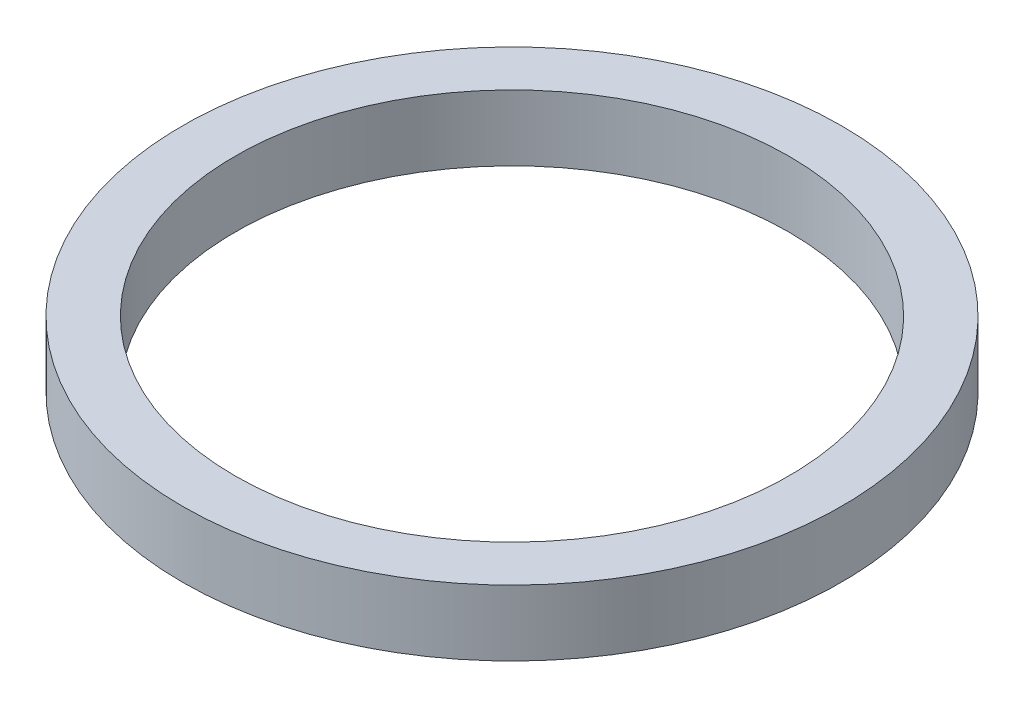
ISO-10303-21;
HEADER;
FILE_DESCRIPTION(('STEP AP214'),'2;1');
FILE_NAME('part.step','',(''),(''),'','','');
FILE_SCHEMA(('AUTOMOTIVE_DESIGN { 1 0 10303 214 1 1 1 1 }'));
ENDSEC;
DATA;
#1=APPLICATION_CONTEXT('core data for automotive mechanical design processes');
#2=APPLICATION_PROTOCOL_DEFINITION('international standard','automotive_design',2000,#1);
#3=PRODUCT_CONTEXT('',#1,'mechanical');
#4=PRODUCT('Part','Part','',(#3));
#5=PRODUCT_RELATED_PRODUCT_CATEGORY('part','',(#4));
#6=PRODUCT_DEFINITION_FORMATION('','',#4);
#7=PRODUCT_DEFINITION_CONTEXT('part definition',#1,'design');
#8=PRODUCT_DEFINITION('design','',#6,#7);
#9=PRODUCT_DEFINITION_SHAPE('','',#8);
#10=(LENGTH_UNIT() NAMED_UNIT(*) SI_UNIT(.MILLI.,.METRE.));
#11=(NAMED_UNIT(*) PLANE_ANGLE_UNIT() SI_UNIT($,.RADIAN.));
#12=(NAMED_UNIT(*) SI_UNIT($,.STERADIAN.) SOLID_ANGLE_UNIT());
#13=UNCERTAINTY_MEASURE_WITH_UNIT(LENGTH_MEASURE(1.E-05),#10,'distance_accuracy_value','');
#14=(GEOMETRIC_REPRESENTATION_CONTEXT(3) GLOBAL_UNCERTAINTY_ASSIGNED_CONTEXT((#13)) GLOBAL_UNIT_ASSIGNED_CONTEXT((#10,
#11,#12)) REPRESENTATION_CONTEXT('',''));
#15=CARTESIAN_POINT('',(0.,0.,0.));
#16=DIRECTION('',(0.,0.,1.));
#17=DIRECTION('',(1.,0.,0.));
#18=AXIS2_PLACEMENT_3D('',#15,#16,#17);
#19=CARTESIAN_POINT('',(0.,5.,0.));
#20=DIRECTION('',(0.,1.,0.));
#21=DIRECTION('',(0.,0.,1.));
#22=AXIS2_PLACEMENT_3D('',#19,#20,#21);
#23=PLANE('',#22);
#24=CARTESIAN_POINT('',(0.,5.,0.));
#25=DIRECTION('',(0.,1.,0.));
#26=DIRECTION('',(0.,0.,1.));
#27=AXIS2_PLACEMENT_3D('',#24,#25,#26);
#28=CIRCLE('',#27,25.05);
#29=CARTESIAN_POINT('',(0.,5.,25.05));
#30=VERTEX_POINT('',#29);
#31=EDGE_CURVE('E10',#30,#30,#28,.T.);
#32=ORIENTED_EDGE('',*,*,#31,.T.);
#33=EDGE_LOOP('',(#32));
#34=FACE_BOUND('',#33,.T.);
#35=CARTESIAN_POINT('',(0.,5.,0.));
#36=DIRECTION('',(0.,1.,0.));
#37=DIRECTION('',(0.,0.,1.));
#38=AXIS2_PLACEMENT_3D('',#35,#36,#37);
#39=CIRCLE('',#38,21.05);
#40=CARTESIAN_POINT('',(0.,5.,21.05));
#41=VERTEX_POINT('',#40);
#42=EDGE_CURVE('E42',#41,#41,#39,.T.);
#43=ORIENTED_EDGE('',*,*,#42,.F.);
#44=EDGE_LOOP('',(#43));
#45=FACE_BOUND('',#44,.T.);
#46=ADVANCED_FACE('F31',(#34,#45),#23,.T.);
#47=CARTESIAN_POINT('',(0.,0.,0.));
#48=DIRECTION('',(0.,1.,0.));
#49=DIRECTION('',(0.,0.,1.));
#50=AXIS2_PLACEMENT_3D('',#47,#48,#49);
#51=PLANE('',#50);
#52=CARTESIAN_POINT('',(0.,0.,0.));
#53=DIRECTION('',(0.,1.,0.));
#54=DIRECTION('',(0.,0.,1.));
#55=AXIS2_PLACEMENT_3D('',#52,#53,#54);
#56=CIRCLE('',#55,25.05);
#57=CARTESIAN_POINT('',(0.,0.,25.05));
#58=VERTEX_POINT('',#57);
#59=EDGE_CURVE('E35',#58,#58,#56,.T.);
#60=ORIENTED_EDGE('',*,*,#59,.F.);
#61=EDGE_LOOP('',(#60));
#62=FACE_BOUND('',#61,.T.);
#63=CARTESIAN_POINT('',(0.,0.,0.));
#64=DIRECTION('',(0.,1.,0.));
#65=DIRECTION('',(0.,0.,1.));
#66=AXIS2_PLACEMENT_3D('',#63,#64,#65);
#67=CIRCLE('',#66,21.05);
#68=CARTESIAN_POINT('',(0.,0.,21.05));
#69=VERTEX_POINT('',#68);
#70=EDGE_CURVE('E44',#69,#69,#67,.T.);
#71=ORIENTED_EDGE('',*,*,#70,.T.);
#72=EDGE_LOOP('',(#71));
#73=FACE_BOUND('',#72,.T.);
#74=ADVANCED_FACE('F54',(#62,#73),#51,.F.);
#75=CARTESIAN_POINT('',(0.,5.,0.));
#76=DIRECTION('',(0.,-1.,0.));
#77=DIRECTION('',(0.,0.,-1.));
#78=AXIS2_PLACEMENT_3D('',#75,#76,#77);
#79=CYLINDRICAL_SURFACE('',#78,25.05);
#80=ORIENTED_EDGE('',*,*,#31,.F.);
#81=EDGE_LOOP('',(#80));
#82=FACE_BOUND('',#81,.T.);
#83=ORIENTED_EDGE('',*,*,#59,.T.);
#84=EDGE_LOOP('',(#83));
#85=FACE_BOUND('',#84,.T.);
#86=ADVANCED_FACE('F33',(#82,#85),#79,.T.);
#87=CARTESIAN_POINT('',(0.,5.,0.));
#88=DIRECTION('',(0.,-1.,0.));
#89=DIRECTION('',(0.,0.,-1.));
#90=AXIS2_PLACEMENT_3D('',#87,#88,#89);
#91=CYLINDRICAL_SURFACE('',#90,21.05);
#92=ORIENTED_EDGE('',*,*,#42,.T.);
#93=EDGE_LOOP('',(#92));
#94=FACE_BOUND('',#93,.T.);
#95=ORIENTED_EDGE('',*,*,#70,.F.);
#96=EDGE_LOOP('',(#95));
#97=FACE_BOUND('',#96,.T.);
#98=ADVANCED_FACE('F50',(#94,#97),#91,.F.);
#99=CLOSED_SHELL('',(#46,#74,#86,#98));
#100=MANIFOLD_SOLID_BREP('B2',#99);
#101=ADVANCED_BREP_SHAPE_REPRESENTATION('',(#18,#100),#14);
#102=SHAPE_DEFINITION_REPRESENTATION(#9,#101);
ENDSEC;
END-ISO-10303-21;
